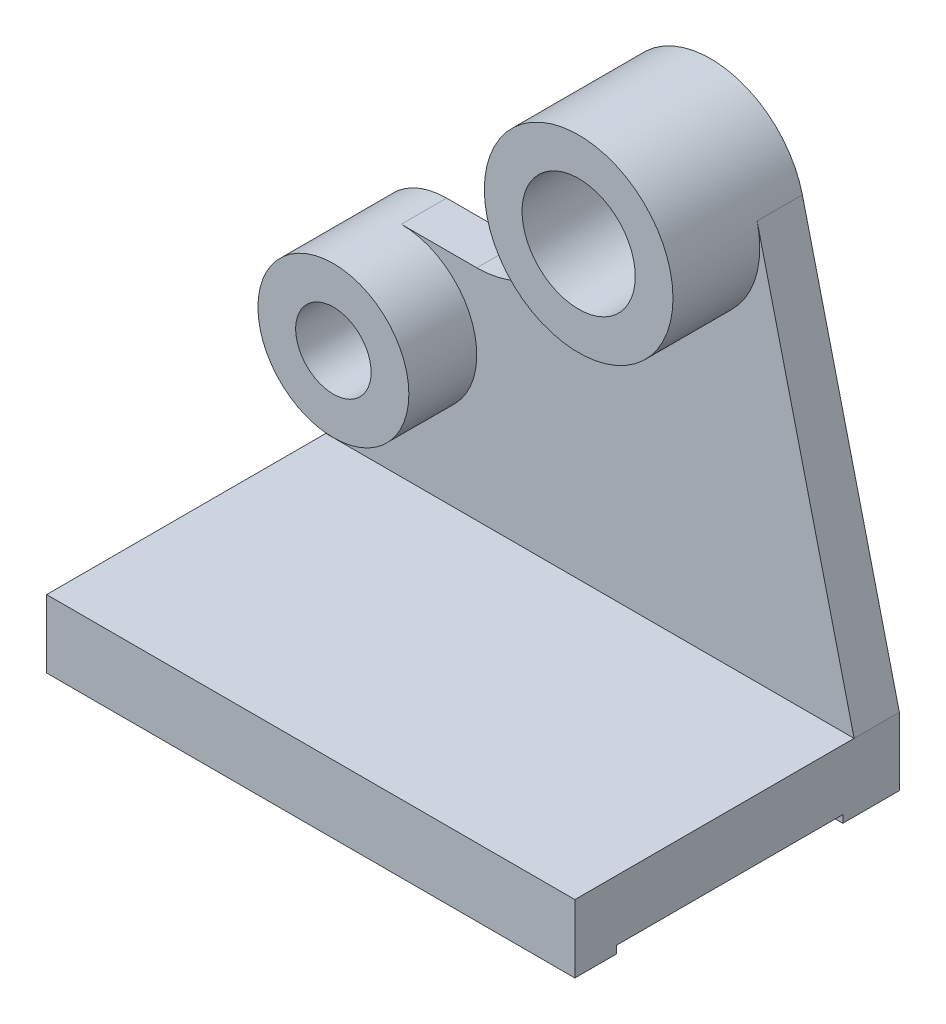
ISO-10303-21;
HEADER;
FILE_DESCRIPTION(('STEP AP214'),'2;1');
FILE_NAME('part.step','',(''),(''),'','','');
FILE_SCHEMA(('AUTOMOTIVE_DESIGN { 1 0 10303 214 1 1 1 1 }'));
ENDSEC;
DATA;
#1=APPLICATION_CONTEXT('core data for automotive mechanical design processes');
#2=APPLICATION_PROTOCOL_DEFINITION('international standard','automotive_design',2000,#1);
#3=PRODUCT_CONTEXT('',#1,'mechanical');
#4=PRODUCT('Part','Part','',(#3));
#5=PRODUCT_RELATED_PRODUCT_CATEGORY('part','',(#4));
#6=PRODUCT_DEFINITION_FORMATION('','',#4);
#7=PRODUCT_DEFINITION_CONTEXT('part definition',#1,'design');
#8=PRODUCT_DEFINITION('design','',#6,#7);
#9=PRODUCT_DEFINITION_SHAPE('','',#8);
#10=(LENGTH_UNIT() NAMED_UNIT(*) SI_UNIT(.MILLI.,.METRE.));
#11=(NAMED_UNIT(*) PLANE_ANGLE_UNIT() SI_UNIT($,.RADIAN.));
#12=(NAMED_UNIT(*) SI_UNIT($,.STERADIAN.) SOLID_ANGLE_UNIT());
#13=UNCERTAINTY_MEASURE_WITH_UNIT(LENGTH_MEASURE(1.E-05),#10,'distance_accuracy_value','');
#14=(GEOMETRIC_REPRESENTATION_CONTEXT(3) GLOBAL_UNCERTAINTY_ASSIGNED_CONTEXT((#13)) GLOBAL_UNIT_ASSIGNED_CONTEXT((#10,
#11,#12)) REPRESENTATION_CONTEXT('',''));
#15=CARTESIAN_POINT('',(0.,0.,0.));
#16=DIRECTION('',(0.,0.,1.));
#17=DIRECTION('',(1.,0.,0.));
#18=AXIS2_PLACEMENT_3D('',#15,#16,#17);
#19=CARTESIAN_POINT('',(0.,0.,86.));
#20=DIRECTION('',(0.,1.,0.));
#21=DIRECTION('',(0.,0.,1.));
#22=AXIS2_PLACEMENT_3D('',#19,#20,#21);
#23=PLANE('',#22);
#24=DIRECTION('',(0.,0.,-1.));
#25=VECTOR('',#24,1.);
#26=CARTESIAN_POINT('',(-90.,0.,86.));
#27=LINE('',#26,#25);
#28=CARTESIAN_POINT('',(-90.,0.,86.));
#29=VERTEX_POINT('',#28);
#30=CARTESIAN_POINT('',(-90.,0.,75.));
#31=VERTEX_POINT('',#30);
#32=EDGE_CURVE('E170',#29,#31,#27,.T.);
#33=ORIENTED_EDGE('',*,*,#32,.T.);
#34=DIRECTION('',(1.,0.,0.));
#35=VECTOR('',#34,1.);
#36=CARTESIAN_POINT('',(-90.001,0.,75.));
#37=LINE('',#36,#35);
#38=CARTESIAN_POINT('',(50.,0.,75.));
#39=VERTEX_POINT('',#38);
#40=EDGE_CURVE('E151',#31,#39,#37,.T.);
#41=ORIENTED_EDGE('',*,*,#40,.T.);
#42=DIRECTION('',(0.,0.,-1.));
#43=VECTOR('',#42,1.);
#44=CARTESIAN_POINT('',(50.,0.,86.));
#45=LINE('',#44,#43);
#46=CARTESIAN_POINT('',(50.,0.,86.));
#47=VERTEX_POINT('',#46);
#48=EDGE_CURVE('E182',#47,#39,#45,.T.);
#49=ORIENTED_EDGE('',*,*,#48,.F.);
#50=DIRECTION('',(1.,0.,0.));
#51=VECTOR('',#50,1.);
#52=CARTESIAN_POINT('',(0.,0.,86.));
#53=LINE('',#52,#51);
#54=EDGE_CURVE('E176',#29,#47,#53,.T.);
#55=ORIENTED_EDGE('',*,*,#54,.F.);
#56=EDGE_LOOP('',(#33,#41,#49,#55));
#57=FACE_BOUND('',#56,.T.);
#58=ADVANCED_FACE('F47',(#57),#23,.F.);
#59=CARTESIAN_POINT('',(50.,0.,86.));
#60=DIRECTION('',(1.,0.,0.));
#61=DIRECTION('',(0.,0.,-1.));
#62=AXIS2_PLACEMENT_3D('',#59,#60,#61);
#63=PLANE('',#62);
#64=DIRECTION('',(0.,-1.,0.));
#65=VECTOR('',#64,1.);
#66=CARTESIAN_POINT('',(50.,1.99999999999999,75.));
#67=LINE('',#66,#65);
#68=CARTESIAN_POINT('',(50.,1.99999999999999,75.));
#69=VERTEX_POINT('',#68);
#70=EDGE_CURVE('E157',#69,#39,#67,.T.);
#71=ORIENTED_EDGE('',*,*,#70,.F.);
#72=DIRECTION('',(0.,0.,1.));
#73=VECTOR('',#72,1.);
#74=CARTESIAN_POINT('',(50.,1.99999999999999,75.));
#75=LINE('',#74,#73);
#76=CARTESIAN_POINT('',(50.,1.99999999999999,15.));
#77=VERTEX_POINT('',#76);
#78=EDGE_CURVE('E164',#77,#69,#75,.T.);
#79=ORIENTED_EDGE('',*,*,#78,.F.);
#80=DIRECTION('',(0.,1.,0.));
#81=VECTOR('',#80,1.);
#82=CARTESIAN_POINT('',(50.,1.99999999999999,15.));
#83=LINE('',#82,#81);
#84=CARTESIAN_POINT('',(50.,0.,15.));
#85=VERTEX_POINT('',#84);
#86=EDGE_CURVE('E324',#85,#77,#83,.T.);
#87=ORIENTED_EDGE('',*,*,#86,.F.);
#88=CARTESIAN_POINT('',(50.,0.,0.));
#89=VERTEX_POINT('',#88);
#90=EDGE_CURVE('E186',#85,#89,#45,.T.);
#91=ORIENTED_EDGE('',*,*,#90,.T.);
#92=DIRECTION('',(0.,-1.,0.));
#93=VECTOR('',#92,1.);
#94=CARTESIAN_POINT('',(50.,0.,0.));
#95=LINE('',#94,#93);
#96=CARTESIAN_POINT('',(50.,18.,0.));
#97=VERTEX_POINT('',#96);
#98=EDGE_CURVE('E196',#97,#89,#95,.T.);
#99=ORIENTED_EDGE('',*,*,#98,.F.);
#100=DIRECTION('',(0.,0.,-1.));
#101=VECTOR('',#100,1.);
#102=CARTESIAN_POINT('',(50.,18.,12.));
#103=LINE('',#102,#101);
#104=CARTESIAN_POINT('',(50.,18.,12.));
#105=VERTEX_POINT('',#104);
#106=EDGE_CURVE('E228',#105,#97,#103,.T.);
#107=ORIENTED_EDGE('',*,*,#106,.F.);
#108=DIRECTION('',(0.,0.,-1.));
#109=VECTOR('',#108,1.);
#110=CARTESIAN_POINT('',(50.,18.,86.));
#111=LINE('',#110,#109);
#112=CARTESIAN_POINT('',(50.,18.,86.));
#113=VERTEX_POINT('',#112);
#114=EDGE_CURVE('E11',#113,#105,#111,.T.);
#115=ORIENTED_EDGE('',*,*,#114,.F.);
#116=DIRECTION('',(0.,-1.,0.));
#117=VECTOR('',#116,1.);
#118=CARTESIAN_POINT('',(50.,0.,86.));
#119=LINE('',#118,#117);
#120=EDGE_CURVE('E191',#113,#47,#119,.T.);
#121=ORIENTED_EDGE('',*,*,#120,.T.);
#122=ORIENTED_EDGE('',*,*,#48,.T.);
#123=EDGE_LOOP('',(#71,#79,#87,#91,#99,#107,#115,#121,#122));
#124=FACE_BOUND('',#123,.T.);
#125=ADVANCED_FACE('F49',(#124),#63,.T.);
#126=CARTESIAN_POINT('',(0.,18.,86.));
#127=DIRECTION('',(0.,1.,0.));
#128=DIRECTION('',(0.,0.,1.));
#129=AXIS2_PLACEMENT_3D('',#126,#127,#128);
#130=PLANE('',#129);
#131=DIRECTION('',(1.,0.,0.));
#132=VECTOR('',#131,1.);
#133=CARTESIAN_POINT('',(0.,18.,12.));
#134=LINE('',#133,#132);
#135=CARTESIAN_POINT('',(-90.,18.,12.));
#136=VERTEX_POINT('',#135);
#137=EDGE_CURVE('E70',#136,#105,#134,.T.);
#138=ORIENTED_EDGE('',*,*,#137,.F.);
#139=DIRECTION('',(0.,0.,-1.));
#140=VECTOR('',#139,1.);
#141=CARTESIAN_POINT('',(-90.,18.,86.));
#142=LINE('',#141,#140);
#143=CARTESIAN_POINT('',(-90.,18.,86.));
#144=VERTEX_POINT('',#143);
#145=EDGE_CURVE('E56',#144,#136,#142,.T.);
#146=ORIENTED_EDGE('',*,*,#145,.F.);
#147=DIRECTION('',(1.,0.,0.));
#148=VECTOR('',#147,1.);
#149=CARTESIAN_POINT('',(0.,18.,86.));
#150=LINE('',#149,#148);
#151=EDGE_CURVE('E206',#144,#113,#150,.T.);
#152=ORIENTED_EDGE('',*,*,#151,.T.);
#153=ORIENTED_EDGE('',*,*,#114,.T.);
#154=EDGE_LOOP('',(#138,#146,#152,#153));
#155=FACE_BOUND('',#154,.T.);
#156=ADVANCED_FACE('F362',(#155),#130,.T.);
#157=CARTESIAN_POINT('',(-90.,0.,86.));
#158=DIRECTION('',(1.,0.,0.));
#159=DIRECTION('',(0.,1.,0.));
#160=AXIS2_PLACEMENT_3D('',#157,#158,#159);
#161=PLANE('',#160);
#162=DIRECTION('',(0.,0.,-1.));
#163=VECTOR('',#162,1.);
#164=CARTESIAN_POINT('',(-90.,1.99999999999999,75.));
#165=LINE('',#164,#163);
#166=CARTESIAN_POINT('',(-90.,1.99999999999999,75.));
#167=VERTEX_POINT('',#166);
#168=CARTESIAN_POINT('',(-90.,1.99999999999999,15.));
#169=VERTEX_POINT('',#168);
#170=EDGE_CURVE('E173',#167,#169,#165,.T.);
#171=ORIENTED_EDGE('',*,*,#170,.F.);
#172=DIRECTION('',(0.,1.,0.));
#173=VECTOR('',#172,1.);
#174=CARTESIAN_POINT('',(-90.,1.99999999999999,75.));
#175=LINE('',#174,#173);
#176=EDGE_CURVE('E154',#31,#167,#175,.T.);
#177=ORIENTED_EDGE('',*,*,#176,.F.);
#178=ORIENTED_EDGE('',*,*,#32,.F.);
#179=DIRECTION('',(0.,-1.,0.));
#180=VECTOR('',#179,1.);
#181=CARTESIAN_POINT('',(-90.,0.,86.));
#182=LINE('',#181,#180);
#183=EDGE_CURVE('E203',#144,#29,#182,.T.);
#184=ORIENTED_EDGE('',*,*,#183,.F.);
#185=ORIENTED_EDGE('',*,*,#145,.T.);
#186=DIRECTION('',(0.,-1.,0.));
#187=VECTOR('',#186,1.);
#188=CARTESIAN_POINT('',(-90.,0.,12.));
#189=LINE('',#188,#187);
#190=CARTESIAN_POINT('',(-90.,56.,12.));
#191=VERTEX_POINT('',#190);
#192=EDGE_CURVE('E264',#191,#136,#189,.T.);
#193=ORIENTED_EDGE('',*,*,#192,.F.);
#194=DIRECTION('',(0.,0.,-1.));
#195=VECTOR('',#194,1.);
#196=CARTESIAN_POINT('',(-90.,56.,12.));
#197=LINE('',#196,#195);
#198=CARTESIAN_POINT('',(-90.,56.,0.));
#199=VERTEX_POINT('',#198);
#200=EDGE_CURVE('E224',#191,#199,#197,.T.);
#201=ORIENTED_EDGE('',*,*,#200,.T.);
#202=DIRECTION('',(0.,-1.,0.));
#203=VECTOR('',#202,1.);
#204=CARTESIAN_POINT('',(-90.,0.,0.));
#205=LINE('',#204,#203);
#206=CARTESIAN_POINT('',(-90.,0.,0.));
#207=VERTEX_POINT('',#206);
#208=EDGE_CURVE('E192',#199,#207,#205,.T.);
#209=ORIENTED_EDGE('',*,*,#208,.T.);
#210=CARTESIAN_POINT('',(-90.,0.,15.));
#211=VERTEX_POINT('',#210);
#212=EDGE_CURVE('E178',#211,#207,#27,.T.);
#213=ORIENTED_EDGE('',*,*,#212,.F.);
#214=DIRECTION('',(0.,-1.,0.));
#215=VECTOR('',#214,1.);
#216=CARTESIAN_POINT('',(-90.,1.99999999999999,15.));
#217=LINE('',#216,#215);
#218=EDGE_CURVE('E63',#169,#211,#217,.T.);
#219=ORIENTED_EDGE('',*,*,#218,.F.);
#220=EDGE_LOOP('',(#171,#177,#178,#184,#185,#193,#201,#209,#213,#219));
#221=FACE_BOUND('',#220,.T.);
#222=ADVANCED_FACE('F168',(#221),#161,.F.);
#223=ORIENTED_EDGE('',*,*,#90,.F.);
#224=DIRECTION('',(1.,0.,0.));
#225=VECTOR('',#224,1.);
#226=CARTESIAN_POINT('',(-90.001,0.,15.));
#227=LINE('',#226,#225);
#228=EDGE_CURVE('E163',#211,#85,#227,.T.);
#229=ORIENTED_EDGE('',*,*,#228,.F.);
#230=ORIENTED_EDGE('',*,*,#212,.T.);
#231=DIRECTION('',(1.,0.,0.));
#232=VECTOR('',#231,1.);
#233=CARTESIAN_POINT('',(0.,0.,0.));
#234=LINE('',#233,#232);
#235=EDGE_CURVE('E187',#207,#89,#234,.T.);
#236=ORIENTED_EDGE('',*,*,#235,.T.);
#237=EDGE_LOOP('',(#223,#229,#230,#236));
#238=FACE_BOUND('',#237,.T.);
#239=ADVANCED_FACE('F341',(#238),#23,.F.);
#240=CARTESIAN_POINT('',(0.,0.,86.));
#241=DIRECTION('',(0.,0.,1.));
#242=DIRECTION('',(1.,0.,0.));
#243=AXIS2_PLACEMENT_3D('',#240,#241,#242);
#244=PLANE('',#243);
#245=ORIENTED_EDGE('',*,*,#120,.F.);
#246=ORIENTED_EDGE('',*,*,#151,.F.);
#247=ORIENTED_EDGE('',*,*,#183,.T.);
#248=ORIENTED_EDGE('',*,*,#54,.T.);
#249=EDGE_LOOP('',(#245,#246,#247,#248));
#250=FACE_BOUND('',#249,.T.);
#251=ADVANCED_FACE('F365',(#250),#244,.T.);
#252=CARTESIAN_POINT('',(0.,0.,0.));
#253=DIRECTION('',(0.,0.,1.));
#254=DIRECTION('',(1.,0.,0.));
#255=AXIS2_PLACEMENT_3D('',#252,#253,#254);
#256=PLANE('',#255);
#257=ORIENTED_EDGE('',*,*,#98,.T.);
#258=ORIENTED_EDGE('',*,*,#235,.F.);
#259=ORIENTED_EDGE('',*,*,#208,.F.);
#260=CARTESIAN_POINT('',(-70.,56.,0.));
#261=DIRECTION('',(0.,0.,1.));
#262=DIRECTION('',(1.,0.,0.));
#263=AXIS2_PLACEMENT_3D('',#260,#261,#262);
#264=CIRCLE('',#263,20.);
#265=CARTESIAN_POINT('',(-70.,76.,0.));
#266=VERTEX_POINT('',#265);
#267=EDGE_CURVE('E298',#266,#199,#264,.T.);
#268=ORIENTED_EDGE('',*,*,#267,.F.);
#269=DIRECTION('',(-1.,0.,0.));
#270=VECTOR('',#269,1.);
#271=CARTESIAN_POINT('',(0.,76.,0.));
#272=LINE('',#271,#270);
#273=CARTESIAN_POINT('',(-50.,76.,0.));
#274=VERTEX_POINT('',#273);
#275=EDGE_CURVE('E244',#274,#266,#272,.T.);
#276=ORIENTED_EDGE('',*,*,#275,.F.);
#277=CARTESIAN_POINT('',(-50.,101.,0.));
#278=DIRECTION('',(0.,0.,1.));
#279=DIRECTION('',(1.,0.,0.));
#280=AXIS2_PLACEMENT_3D('',#277,#278,#279);
#281=CIRCLE('',#280,25.);
#282=CARTESIAN_POINT('',(-25.,101.,0.));
#283=VERTEX_POINT('',#282);
#284=EDGE_CURVE('E247',#283,#274,#281,.F.);
#285=ORIENTED_EDGE('',*,*,#284,.F.);
#286=DIRECTION('',(0.,-1.,0.));
#287=VECTOR('',#286,1.);
#288=CARTESIAN_POINT('',(-25.,0.,0.));
#289=LINE('',#288,#287);
#290=CARTESIAN_POINT('',(-25.,118.,0.));
#291=VERTEX_POINT('',#290);
#292=EDGE_CURVE('E250',#291,#283,#289,.T.);
#293=ORIENTED_EDGE('',*,*,#292,.F.);
#294=CARTESIAN_POINT('',(0.,118.,0.));
#295=DIRECTION('',(0.,0.,1.));
#296=DIRECTION('',(1.,0.,0.));
#297=AXIS2_PLACEMENT_3D('',#294,#295,#296);
#298=CIRCLE('',#297,25.);
#299=CARTESIAN_POINT('',(24.2944947177033,123.897247358852,0.));
#300=VERTEX_POINT('',#299);
#301=EDGE_CURVE('E282',#300,#291,#298,.T.);
#302=ORIENTED_EDGE('',*,*,#301,.F.);
#303=DIRECTION('',(-0.235889894354067,0.971779788708135,0.));
#304=VECTOR('',#303,1.);
#305=CARTESIAN_POINT('',(51.3439924575694,12.4632443453397,0.));
#306=LINE('',#305,#304);
#307=EDGE_CURVE('E240',#97,#300,#306,.T.);
#308=ORIENTED_EDGE('',*,*,#307,.F.);
#309=EDGE_LOOP('',(#257,#258,#259,#268,#276,#285,#293,#302,#308));
#310=FACE_BOUND('',#309,.T.);
#311=CARTESIAN_POINT('',(0.,118.,0.));
#312=DIRECTION('',(0.,0.,1.));
#313=DIRECTION('',(1.,0.,0.));
#314=AXIS2_PLACEMENT_3D('',#311,#312,#313);
#315=CIRCLE('',#314,15.);
#316=CARTESIAN_POINT('',(15.,118.,0.));
#317=VERTEX_POINT('',#316);
#318=EDGE_CURVE('E287',#317,#317,#315,.T.);
#319=ORIENTED_EDGE('',*,*,#318,.T.);
#320=EDGE_LOOP('',(#319));
#321=FACE_BOUND('',#320,.T.);
#322=CARTESIAN_POINT('',(-70.,56.,0.));
#323=DIRECTION('',(0.,0.,1.));
#324=DIRECTION('',(1.,0.,0.));
#325=AXIS2_PLACEMENT_3D('',#322,#323,#324);
#326=CIRCLE('',#325,9.99999999999999);
#327=CARTESIAN_POINT('',(-60.,56.,0.));
#328=VERTEX_POINT('',#327);
#329=EDGE_CURVE('E303',#328,#328,#326,.T.);
#330=ORIENTED_EDGE('',*,*,#329,.T.);
#331=EDGE_LOOP('',(#330));
#332=FACE_BOUND('',#331,.T.);
#333=ADVANCED_FACE('F345',(#310,#321,#332),#256,.F.);
#334=CARTESIAN_POINT('',(-25.,0.,12.));
#335=DIRECTION('',(1.,0.,0.));
#336=DIRECTION('',(0.,1.,0.));
#337=AXIS2_PLACEMENT_3D('',#334,#335,#336);
#338=PLANE('',#337);
#339=ORIENTED_EDGE('',*,*,#292,.T.);
#340=DIRECTION('',(0.,0.,-1.));
#341=VECTOR('',#340,1.);
#342=CARTESIAN_POINT('',(-25.,101.,12.));
#343=LINE('',#342,#341);
#344=CARTESIAN_POINT('',(-25.,101.,12.));
#345=VERTEX_POINT('',#344);
#346=EDGE_CURVE('E200',#345,#283,#343,.T.);
#347=ORIENTED_EDGE('',*,*,#346,.F.);
#348=DIRECTION('',(0.,-1.,0.));
#349=VECTOR('',#348,1.);
#350=CARTESIAN_POINT('',(-25.,0.,12.));
#351=LINE('',#350,#349);
#352=CARTESIAN_POINT('',(-25.,118.,12.));
#353=VERTEX_POINT('',#352);
#354=EDGE_CURVE('E243',#353,#345,#351,.T.);
#355=ORIENTED_EDGE('',*,*,#354,.F.);
#356=DIRECTION('',(0.,0.,-1.));
#357=VECTOR('',#356,1.);
#358=CARTESIAN_POINT('',(-25.,118.,12.));
#359=LINE('',#358,#357);
#360=EDGE_CURVE('E236',#353,#291,#359,.T.);
#361=ORIENTED_EDGE('',*,*,#360,.T.);
#362=EDGE_LOOP('',(#339,#347,#355,#361));
#363=FACE_BOUND('',#362,.T.);
#364=ADVANCED_FACE('F380',(#363),#338,.F.);
#365=CARTESIAN_POINT('',(-50.,101.,12.));
#366=DIRECTION('',(0.,0.,-1.));
#367=DIRECTION('',(-1.,0.,0.));
#368=AXIS2_PLACEMENT_3D('',#365,#366,#367);
#369=CYLINDRICAL_SURFACE('',#368,25.);
#370=ORIENTED_EDGE('',*,*,#284,.T.);
#371=DIRECTION('',(0.,0.,-1.));
#372=VECTOR('',#371,1.);
#373=CARTESIAN_POINT('',(-50.,76.,12.));
#374=LINE('',#373,#372);
#375=CARTESIAN_POINT('',(-50.,76.,12.));
#376=VERTEX_POINT('',#375);
#377=EDGE_CURVE('E216',#376,#274,#374,.T.);
#378=ORIENTED_EDGE('',*,*,#377,.F.);
#379=CARTESIAN_POINT('',(-50.,101.,12.));
#380=DIRECTION('',(0.,0.,1.));
#381=DIRECTION('',(1.,0.,0.));
#382=AXIS2_PLACEMENT_3D('',#379,#380,#381);
#383=CIRCLE('',#382,25.);
#384=EDGE_CURVE('E276',#345,#376,#383,.F.);
#385=ORIENTED_EDGE('',*,*,#384,.F.);
#386=ORIENTED_EDGE('',*,*,#346,.T.);
#387=EDGE_LOOP('',(#370,#378,#385,#386));
#388=FACE_BOUND('',#387,.T.);
#389=ADVANCED_FACE('F378',(#388),#369,.F.);
#390=CARTESIAN_POINT('',(0.,76.,12.));
#391=DIRECTION('',(0.,-1.,0.));
#392=DIRECTION('',(1.,0.,0.));
#393=AXIS2_PLACEMENT_3D('',#390,#391,#392);
#394=PLANE('',#393);
#395=ORIENTED_EDGE('',*,*,#275,.T.);
#396=DIRECTION('',(0.,0.,-1.));
#397=VECTOR('',#396,1.);
#398=CARTESIAN_POINT('',(-70.,76.,12.));
#399=LINE('',#398,#397);
#400=CARTESIAN_POINT('',(-70.,76.,12.));
#401=VERTEX_POINT('',#400);
#402=EDGE_CURVE('E220',#401,#266,#399,.T.);
#403=ORIENTED_EDGE('',*,*,#402,.F.);
#404=DIRECTION('',(-1.,0.,0.));
#405=VECTOR('',#404,1.);
#406=CARTESIAN_POINT('',(0.,76.,12.));
#407=LINE('',#406,#405);
#408=EDGE_CURVE('E272',#376,#401,#407,.T.);
#409=ORIENTED_EDGE('',*,*,#408,.F.);
#410=ORIENTED_EDGE('',*,*,#377,.T.);
#411=EDGE_LOOP('',(#395,#403,#409,#410));
#412=FACE_BOUND('',#411,.T.);
#413=ADVANCED_FACE('F375',(#412),#394,.F.);
#414=CARTESIAN_POINT('',(51.3439924575694,12.4632443453397,12.));
#415=DIRECTION('',(-0.971779788708135,-0.235889894354067,0.));
#416=DIRECTION('',(0.235889894354067,-0.971779788708135,0.));
#417=AXIS2_PLACEMENT_3D('',#414,#415,#416);
#418=PLANE('',#417);
#419=ORIENTED_EDGE('',*,*,#307,.T.);
#420=DIRECTION('',(0.,0.,-1.));
#421=VECTOR('',#420,1.);
#422=CARTESIAN_POINT('',(24.2944947177033,123.897247358852,12.));
#423=LINE('',#422,#421);
#424=CARTESIAN_POINT('',(24.2944947177033,123.897247358852,12.));
#425=VERTEX_POINT('',#424);
#426=EDGE_CURVE('E232',#425,#300,#423,.T.);
#427=ORIENTED_EDGE('',*,*,#426,.F.);
#428=DIRECTION('',(-0.235889894354067,0.971779788708135,0.));
#429=VECTOR('',#428,1.);
#430=CARTESIAN_POINT('',(51.3439924575694,12.4632443453397,12.));
#431=LINE('',#430,#429);
#432=EDGE_CURVE('E258',#105,#425,#431,.T.);
#433=ORIENTED_EDGE('',*,*,#432,.F.);
#434=ORIENTED_EDGE('',*,*,#106,.T.);
#435=EDGE_LOOP('',(#419,#427,#433,#434));
#436=FACE_BOUND('',#435,.T.);
#437=ADVANCED_FACE('F350',(#436),#418,.F.);
#438=CARTESIAN_POINT('',(0.,0.,12.));
#439=DIRECTION('',(0.,0.,1.));
#440=DIRECTION('',(1.,0.,0.));
#441=AXIS2_PLACEMENT_3D('',#438,#439,#440);
#442=PLANE('',#441);
#443=ORIENTED_EDGE('',*,*,#354,.T.);
#444=ORIENTED_EDGE('',*,*,#384,.T.);
#445=ORIENTED_EDGE('',*,*,#408,.T.);
#446=CARTESIAN_POINT('',(-70.,56.,12.));
#447=DIRECTION('',(0.,0.,1.));
#448=DIRECTION('',(1.,0.,0.));
#449=AXIS2_PLACEMENT_3D('',#446,#447,#448);
#450=CIRCLE('',#449,20.);
#451=EDGE_CURVE('E268',#191,#401,#450,.T.);
#452=ORIENTED_EDGE('',*,*,#451,.F.);
#453=ORIENTED_EDGE('',*,*,#192,.T.);
#454=ORIENTED_EDGE('',*,*,#137,.T.);
#455=ORIENTED_EDGE('',*,*,#432,.T.);
#456=CARTESIAN_POINT('',(0.,118.,12.));
#457=DIRECTION('',(0.,0.,1.));
#458=DIRECTION('',(1.,0.,0.));
#459=AXIS2_PLACEMENT_3D('',#456,#457,#458);
#460=CIRCLE('',#459,25.);
#461=EDGE_CURVE('E239',#353,#425,#460,.T.);
#462=ORIENTED_EDGE('',*,*,#461,.F.);
#463=EDGE_LOOP('',(#443,#444,#445,#452,#453,#454,#455,#462));
#464=FACE_BOUND('',#463,.T.);
#465=ADVANCED_FACE('F357',(#464),#442,.T.);
#466=CARTESIAN_POINT('',(0.,118.,35.));
#467=DIRECTION('',(0.,0.,-1.));
#468=DIRECTION('',(-1.,0.,0.));
#469=AXIS2_PLACEMENT_3D('',#466,#467,#468);
#470=CYLINDRICAL_SURFACE('',#469,25.);
#471=CARTESIAN_POINT('',(0.,118.,35.));
#472=DIRECTION('',(0.,0.,1.));
#473=DIRECTION('',(1.,0.,0.));
#474=AXIS2_PLACEMENT_3D('',#471,#472,#473);
#475=CIRCLE('',#474,25.);
#476=CARTESIAN_POINT('',(25.,118.,35.));
#477=VERTEX_POINT('',#476);
#478=EDGE_CURVE('E254',#477,#477,#475,.T.);
#479=ORIENTED_EDGE('',*,*,#478,.F.);
#480=EDGE_LOOP('',(#479));
#481=FACE_BOUND('',#480,.T.);
#482=ORIENTED_EDGE('',*,*,#301,.T.);
#483=ORIENTED_EDGE('',*,*,#360,.F.);
#484=ORIENTED_EDGE('',*,*,#461,.T.);
#485=ORIENTED_EDGE('',*,*,#426,.T.);
#486=EDGE_LOOP('',(#482,#483,#484,#485));
#487=FACE_BOUND('',#486,.T.);
#488=ADVANCED_FACE('F353',(#481,#487),#470,.T.);
#489=CARTESIAN_POINT('',(0.,118.,35.));
#490=DIRECTION('',(0.,0.,-1.));
#491=DIRECTION('',(-1.,0.,0.));
#492=AXIS2_PLACEMENT_3D('',#489,#490,#491);
#493=CYLINDRICAL_SURFACE('',#492,15.);
#494=CARTESIAN_POINT('',(0.,118.,35.));
#495=DIRECTION('',(0.,0.,1.));
#496=DIRECTION('',(1.,0.,0.));
#497=AXIS2_PLACEMENT_3D('',#494,#495,#496);
#498=CIRCLE('',#497,15.);
#499=CARTESIAN_POINT('',(15.,118.,35.));
#500=VERTEX_POINT('',#499);
#501=EDGE_CURVE('E286',#500,#500,#498,.T.);
#502=ORIENTED_EDGE('',*,*,#501,.T.);
#503=EDGE_LOOP('',(#502));
#504=FACE_BOUND('',#503,.T.);
#505=ORIENTED_EDGE('',*,*,#318,.F.);
#506=EDGE_LOOP('',(#505));
#507=FACE_BOUND('',#506,.T.);
#508=ADVANCED_FACE('F467',(#504,#507),#493,.F.);
#509=CARTESIAN_POINT('',(0.,0.,35.));
#510=DIRECTION('',(0.,0.,1.));
#511=DIRECTION('',(1.,0.,0.));
#512=AXIS2_PLACEMENT_3D('',#509,#510,#511);
#513=PLANE('',#512);
#514=ORIENTED_EDGE('',*,*,#501,.F.);
#515=EDGE_LOOP('',(#514));
#516=FACE_BOUND('',#515,.T.);
#517=ORIENTED_EDGE('',*,*,#478,.T.);
#518=EDGE_LOOP('',(#517));
#519=FACE_BOUND('',#518,.T.);
#520=ADVANCED_FACE('F476',(#516,#519),#513,.T.);
#521=CARTESIAN_POINT('',(-70.,56.,30.));
#522=DIRECTION('',(0.,0.,-1.));
#523=DIRECTION('',(-1.,0.,0.));
#524=AXIS2_PLACEMENT_3D('',#521,#522,#523);
#525=CYLINDRICAL_SURFACE('',#524,20.);
#526=CARTESIAN_POINT('',(-70.,56.,30.));
#527=DIRECTION('',(0.,0.,1.));
#528=DIRECTION('',(1.,0.,0.));
#529=AXIS2_PLACEMENT_3D('',#526,#527,#528);
#530=CIRCLE('',#529,20.);
#531=CARTESIAN_POINT('',(-50.,56.,30.));
#532=VERTEX_POINT('',#531);
#533=EDGE_CURVE('E291',#532,#532,#530,.T.);
#534=ORIENTED_EDGE('',*,*,#533,.F.);
#535=EDGE_LOOP('',(#534));
#536=FACE_BOUND('',#535,.T.);
#537=ORIENTED_EDGE('',*,*,#267,.T.);
#538=ORIENTED_EDGE('',*,*,#200,.F.);
#539=ORIENTED_EDGE('',*,*,#451,.T.);
#540=ORIENTED_EDGE('',*,*,#402,.T.);
#541=EDGE_LOOP('',(#537,#538,#539,#540));
#542=FACE_BOUND('',#541,.T.);
#543=ADVANCED_FACE('F372',(#536,#542),#525,.T.);
#544=CARTESIAN_POINT('',(-70.,56.,30.));
#545=DIRECTION('',(0.,0.,-1.));
#546=DIRECTION('',(-1.,0.,0.));
#547=AXIS2_PLACEMENT_3D('',#544,#545,#546);
#548=CYLINDRICAL_SURFACE('',#547,9.99999999999999);
#549=CARTESIAN_POINT('',(-70.,56.,30.));
#550=DIRECTION('',(0.,0.,1.));
#551=DIRECTION('',(1.,0.,0.));
#552=AXIS2_PLACEMENT_3D('',#549,#550,#551);
#553=CIRCLE('',#552,9.99999999999999);
#554=CARTESIAN_POINT('',(-60.,56.,30.));
#555=VERTEX_POINT('',#554);
#556=EDGE_CURVE('E302',#555,#555,#553,.T.);
#557=ORIENTED_EDGE('',*,*,#556,.T.);
#558=EDGE_LOOP('',(#557));
#559=FACE_BOUND('',#558,.T.);
#560=ORIENTED_EDGE('',*,*,#329,.F.);
#561=EDGE_LOOP('',(#560));
#562=FACE_BOUND('',#561,.T.);
#563=ADVANCED_FACE('F493',(#559,#562),#548,.F.);
#564=CARTESIAN_POINT('',(0.,0.,30.));
#565=DIRECTION('',(0.,0.,1.));
#566=DIRECTION('',(1.,0.,0.));
#567=AXIS2_PLACEMENT_3D('',#564,#565,#566);
#568=PLANE('',#567);
#569=ORIENTED_EDGE('',*,*,#556,.F.);
#570=EDGE_LOOP('',(#569));
#571=FACE_BOUND('',#570,.T.);
#572=ORIENTED_EDGE('',*,*,#533,.T.);
#573=EDGE_LOOP('',(#572));
#574=FACE_BOUND('',#573,.T.);
#575=ADVANCED_FACE('F502',(#571,#574),#568,.T.);
#576=CARTESIAN_POINT('',(-90.001,1.99999999999999,75.));
#577=DIRECTION('',(0.,0.,1.));
#578=DIRECTION('',(1.,0.,0.));
#579=AXIS2_PLACEMENT_3D('',#576,#577,#578);
#580=PLANE('',#579);
#581=ORIENTED_EDGE('',*,*,#176,.T.);
#582=DIRECTION('',(1.,0.,0.));
#583=VECTOR('',#582,1.);
#584=CARTESIAN_POINT('',(-90.001,1.99999999999999,75.));
#585=LINE('',#584,#583);
#586=EDGE_CURVE('E307',#167,#69,#585,.T.);
#587=ORIENTED_EDGE('',*,*,#586,.T.);
#588=ORIENTED_EDGE('',*,*,#70,.T.);
#589=ORIENTED_EDGE('',*,*,#40,.F.);
#590=EDGE_LOOP('',(#581,#587,#588,#589));
#591=FACE_BOUND('',#590,.T.);
#592=ADVANCED_FACE('F153',(#591),#580,.F.);
#593=CARTESIAN_POINT('',(-90.001,1.99999999999999,75.));
#594=DIRECTION('',(0.,1.,0.));
#595=DIRECTION('',(0.,0.,1.));
#596=AXIS2_PLACEMENT_3D('',#593,#594,#595);
#597=PLANE('',#596);
#598=ORIENTED_EDGE('',*,*,#170,.T.);
#599=DIRECTION('',(1.,0.,0.));
#600=VECTOR('',#599,1.);
#601=CARTESIAN_POINT('',(-90.001,1.99999999999999,15.));
#602=LINE('',#601,#600);
#603=EDGE_CURVE('E316',#169,#77,#602,.T.);
#604=ORIENTED_EDGE('',*,*,#603,.T.);
#605=ORIENTED_EDGE('',*,*,#78,.T.);
#606=ORIENTED_EDGE('',*,*,#586,.F.);
#607=EDGE_LOOP('',(#598,#604,#605,#606));
#608=FACE_BOUND('',#607,.T.);
#609=ADVANCED_FACE('F367',(#608),#597,.F.);
#610=CARTESIAN_POINT('',(-90.001,1.99999999999999,15.));
#611=DIRECTION('',(0.,0.,-1.));
#612=DIRECTION('',(-1.,0.,0.));
#613=AXIS2_PLACEMENT_3D('',#610,#611,#612);
#614=PLANE('',#613);
#615=ORIENTED_EDGE('',*,*,#218,.T.);
#616=ORIENTED_EDGE('',*,*,#228,.T.);
#617=ORIENTED_EDGE('',*,*,#86,.T.);
#618=ORIENTED_EDGE('',*,*,#603,.F.);
#619=EDGE_LOOP('',(#615,#616,#617,#618));
#620=FACE_BOUND('',#619,.T.);
#621=ADVANCED_FACE('F368',(#620),#614,.F.);
#622=CLOSED_SHELL('',(#58,#125,#156,#222,#239,#251,#333,#364,#389,#413,#437,#465,#488,#508,#520,
#543,#563,#575,#592,#609,#621));
#623=MANIFOLD_SOLID_BREP('B2',#622);
#624=ADVANCED_BREP_SHAPE_REPRESENTATION('',(#18,#623),#14);
#625=SHAPE_DEFINITION_REPRESENTATION(#9,#624);
ENDSEC;
END-ISO-10303-21;
